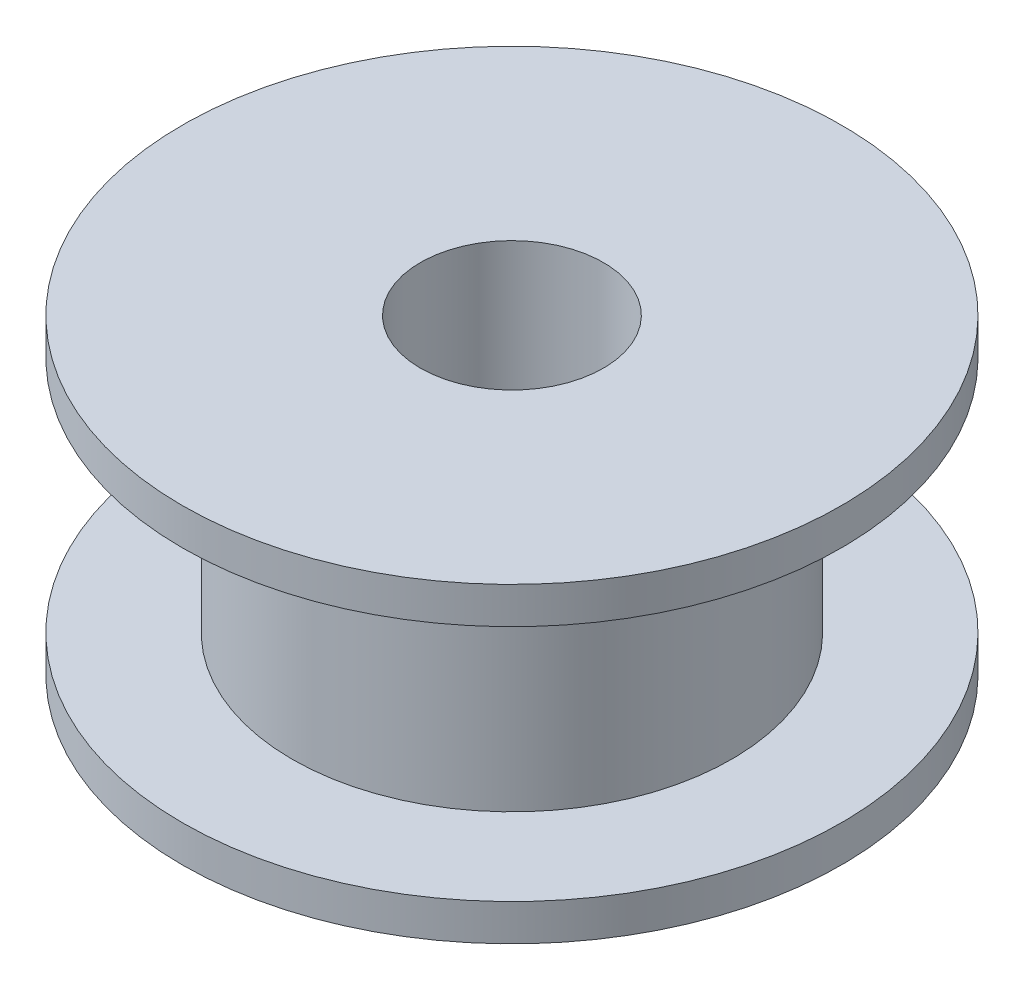
ISO-10303-21;
HEADER;
FILE_DESCRIPTION(('STEP AP214'),'2;1');
FILE_NAME('part.step','',(''),(''),'','','');
FILE_SCHEMA(('AUTOMOTIVE_DESIGN { 1 0 10303 214 1 1 1 1 }'));
ENDSEC;
DATA;
#1=APPLICATION_CONTEXT('core data for automotive mechanical design processes');
#2=APPLICATION_PROTOCOL_DEFINITION('international standard','automotive_design',2000,#1);
#3=PRODUCT_CONTEXT('',#1,'mechanical');
#4=PRODUCT('Part','Part','',(#3));
#5=PRODUCT_RELATED_PRODUCT_CATEGORY('part','',(#4));
#6=PRODUCT_DEFINITION_FORMATION('','',#4);
#7=PRODUCT_DEFINITION_CONTEXT('part definition',#1,'design');
#8=PRODUCT_DEFINITION('design','',#6,#7);
#9=PRODUCT_DEFINITION_SHAPE('','',#8);
#10=(LENGTH_UNIT() NAMED_UNIT(*) SI_UNIT(.MILLI.,.METRE.));
#11=(NAMED_UNIT(*) PLANE_ANGLE_UNIT() SI_UNIT($,.RADIAN.));
#12=(NAMED_UNIT(*) SI_UNIT($,.STERADIAN.) SOLID_ANGLE_UNIT());
#13=UNCERTAINTY_MEASURE_WITH_UNIT(LENGTH_MEASURE(1.E-05),#10,'distance_accuracy_value','');
#14=(GEOMETRIC_REPRESENTATION_CONTEXT(3) GLOBAL_UNCERTAINTY_ASSIGNED_CONTEXT((#13)) GLOBAL_UNIT_ASSIGNED_CONTEXT((#10,
#11,#12)) REPRESENTATION_CONTEXT('',''));
#15=CARTESIAN_POINT('',(0.,0.,0.));
#16=DIRECTION('',(0.,0.,1.));
#17=DIRECTION('',(1.,0.,0.));
#18=AXIS2_PLACEMENT_3D('',#15,#16,#17);
#19=CARTESIAN_POINT('',(9.,4.25,0.));
#20=DIRECTION('',(0.,-1.,0.));
#21=DIRECTION('',(0.,0.,-1.));
#22=AXIS2_PLACEMENT_3D('',#19,#20,#21);
#23=PLANE('',#22);
#24=CARTESIAN_POINT('',(0.,4.25,0.));
#25=DIRECTION('',(0.,1.,0.));
#26=DIRECTION('',(0.,0.,1.));
#27=AXIS2_PLACEMENT_3D('',#24,#25,#26);
#28=CIRCLE('',#27,2.5);
#29=CARTESIAN_POINT('',(0.,4.25,2.5));
#30=VERTEX_POINT('',#29);
#31=EDGE_CURVE('E60',#30,#30,#28,.T.);
#32=ORIENTED_EDGE('',*,*,#31,.F.);
#33=EDGE_LOOP('',(#32));
#34=FACE_BOUND('',#33,.T.);
#35=CARTESIAN_POINT('',(0.,4.25,0.));
#36=DIRECTION('',(0.,1.,0.));
#37=DIRECTION('',(0.,0.,1.));
#38=AXIS2_PLACEMENT_3D('',#35,#36,#37);
#39=CIRCLE('',#38,9.);
#40=CARTESIAN_POINT('',(0.,4.25,9.));
#41=VERTEX_POINT('',#40);
#42=EDGE_CURVE('E54',#41,#41,#39,.T.);
#43=ORIENTED_EDGE('',*,*,#42,.T.);
#44=EDGE_LOOP('',(#43));
#45=FACE_BOUND('',#44,.T.);
#46=ADVANCED_FACE('F32',(#34,#45),#23,.F.);
#47=CARTESIAN_POINT('',(0.,-4.25,0.));
#48=DIRECTION('',(0.,1.,0.));
#49=DIRECTION('',(0.,0.,1.));
#50=AXIS2_PLACEMENT_3D('',#47,#48,#49);
#51=PLANE('',#50);
#52=CARTESIAN_POINT('',(0.,-4.25,0.));
#53=DIRECTION('',(0.,1.,0.));
#54=DIRECTION('',(0.,0.,1.));
#55=AXIS2_PLACEMENT_3D('',#52,#53,#54);
#56=CIRCLE('',#55,2.5);
#57=CARTESIAN_POINT('',(0.,-4.25,2.5));
#58=VERTEX_POINT('',#57);
#59=EDGE_CURVE('E57',#58,#58,#56,.F.);
#60=ORIENTED_EDGE('',*,*,#59,.F.);
#61=EDGE_LOOP('',(#60));
#62=FACE_BOUND('',#61,.T.);
#63=CARTESIAN_POINT('',(0.,-4.25,0.));
#64=DIRECTION('',(0.,1.,0.));
#65=DIRECTION('',(0.,0.,1.));
#66=AXIS2_PLACEMENT_3D('',#63,#64,#65);
#67=CIRCLE('',#66,9.);
#68=CARTESIAN_POINT('',(0.,-4.25,9.));
#69=VERTEX_POINT('',#68);
#70=EDGE_CURVE('E10',#69,#69,#67,.T.);
#71=ORIENTED_EDGE('',*,*,#70,.F.);
#72=EDGE_LOOP('',(#71));
#73=FACE_BOUND('',#72,.T.);
#74=ADVANCED_FACE('F69',(#62,#73),#51,.F.);
#75=CARTESIAN_POINT('',(0.,4.25,0.));
#76=DIRECTION('',(0.,1.,0.));
#77=DIRECTION('',(0.,0.,1.));
#78=AXIS2_PLACEMENT_3D('',#75,#76,#77);
#79=CYLINDRICAL_SURFACE('',#78,9.);
#80=CARTESIAN_POINT('',(0.,-3.25,0.));
#81=DIRECTION('',(0.,1.,0.));
#82=DIRECTION('',(0.,0.,1.));
#83=AXIS2_PLACEMENT_3D('',#80,#81,#82);
#84=CIRCLE('',#83,9.);
#85=CARTESIAN_POINT('',(0.,-3.25,9.));
#86=VERTEX_POINT('',#85);
#87=EDGE_CURVE('E38',#86,#86,#84,.T.);
#88=ORIENTED_EDGE('',*,*,#87,.F.);
#89=EDGE_LOOP('',(#88));
#90=FACE_BOUND('',#89,.T.);
#91=ORIENTED_EDGE('',*,*,#70,.T.);
#92=EDGE_LOOP('',(#91));
#93=FACE_BOUND('',#92,.T.);
#94=ADVANCED_FACE('F92',(#90,#93),#79,.T.);
#95=CARTESIAN_POINT('',(9.,-3.25,0.));
#96=DIRECTION('',(0.,-1.,0.));
#97=DIRECTION('',(0.,0.,-1.));
#98=AXIS2_PLACEMENT_3D('',#95,#96,#97);
#99=PLANE('',#98);
#100=CARTESIAN_POINT('',(0.,-3.25,0.));
#101=DIRECTION('',(0.,1.,0.));
#102=DIRECTION('',(0.,0.,1.));
#103=AXIS2_PLACEMENT_3D('',#100,#101,#102);
#104=CIRCLE('',#103,6.00000000000001);
#105=CARTESIAN_POINT('',(0.,-3.25,6.00000000000001));
#106=VERTEX_POINT('',#105);
#107=EDGE_CURVE('E42',#106,#106,#104,.T.);
#108=ORIENTED_EDGE('',*,*,#107,.F.);
#109=EDGE_LOOP('',(#108));
#110=FACE_BOUND('',#109,.T.);
#111=ORIENTED_EDGE('',*,*,#87,.T.);
#112=EDGE_LOOP('',(#111));
#113=FACE_BOUND('',#112,.T.);
#114=ADVANCED_FACE('F87',(#110,#113),#99,.F.);
#115=CARTESIAN_POINT('',(0.,4.25,0.));
#116=DIRECTION('',(0.,1.,0.));
#117=DIRECTION('',(0.,0.,1.));
#118=AXIS2_PLACEMENT_3D('',#115,#116,#117);
#119=CYLINDRICAL_SURFACE('',#118,6.00000000000001);
#120=CARTESIAN_POINT('',(0.,3.25,0.));
#121=DIRECTION('',(0.,1.,0.));
#122=DIRECTION('',(0.,0.,1.));
#123=AXIS2_PLACEMENT_3D('',#120,#121,#122);
#124=CIRCLE('',#123,6.00000000000001);
#125=CARTESIAN_POINT('',(0.,3.25,6.00000000000001));
#126=VERTEX_POINT('',#125);
#127=EDGE_CURVE('E46',#126,#126,#124,.T.);
#128=ORIENTED_EDGE('',*,*,#127,.F.);
#129=EDGE_LOOP('',(#128));
#130=FACE_BOUND('',#129,.T.);
#131=ORIENTED_EDGE('',*,*,#107,.T.);
#132=EDGE_LOOP('',(#131));
#133=FACE_BOUND('',#132,.T.);
#134=ADVANCED_FACE('F81',(#130,#133),#119,.T.);
#135=CARTESIAN_POINT('',(6.00000000000001,3.25,0.));
#136=DIRECTION('',(0.,1.,0.));
#137=DIRECTION('',(0.,0.,1.));
#138=AXIS2_PLACEMENT_3D('',#135,#136,#137);
#139=PLANE('',#138);
#140=CARTESIAN_POINT('',(0.,3.25,0.));
#141=DIRECTION('',(0.,1.,0.));
#142=DIRECTION('',(0.,0.,1.));
#143=AXIS2_PLACEMENT_3D('',#140,#141,#142);
#144=CIRCLE('',#143,9.);
#145=CARTESIAN_POINT('',(0.,3.25,9.));
#146=VERTEX_POINT('',#145);
#147=EDGE_CURVE('E51',#146,#146,#144,.T.);
#148=ORIENTED_EDGE('',*,*,#147,.F.);
#149=EDGE_LOOP('',(#148));
#150=FACE_BOUND('',#149,.T.);
#151=ORIENTED_EDGE('',*,*,#127,.T.);
#152=EDGE_LOOP('',(#151));
#153=FACE_BOUND('',#152,.T.);
#154=ADVANCED_FACE('F75',(#150,#153),#139,.F.);
#155=CARTESIAN_POINT('',(0.,4.25,0.));
#156=DIRECTION('',(0.,1.,0.));
#157=DIRECTION('',(0.,0.,1.));
#158=AXIS2_PLACEMENT_3D('',#155,#156,#157);
#159=CYLINDRICAL_SURFACE('',#158,9.);
#160=ORIENTED_EDGE('',*,*,#42,.F.);
#161=EDGE_LOOP('',(#160));
#162=FACE_BOUND('',#161,.T.);
#163=ORIENTED_EDGE('',*,*,#147,.T.);
#164=EDGE_LOOP('',(#163));
#165=FACE_BOUND('',#164,.T.);
#166=ADVANCED_FACE('F72',(#162,#165),#159,.T.);
#167=CARTESIAN_POINT('',(0.,-4.251,0.));
#168=DIRECTION('',(0.,1.,0.));
#169=DIRECTION('',(0.,0.,1.));
#170=AXIS2_PLACEMENT_3D('',#167,#168,#169);
#171=CYLINDRICAL_SURFACE('',#170,2.5);
#172=ORIENTED_EDGE('',*,*,#31,.T.);
#173=EDGE_LOOP('',(#172));
#174=FACE_BOUND('',#173,.T.);
#175=ORIENTED_EDGE('',*,*,#59,.T.);
#176=EDGE_LOOP('',(#175));
#177=FACE_BOUND('',#176,.T.);
#178=ADVANCED_FACE('F64',(#174,#177),#171,.F.);
#179=CLOSED_SHELL('',(#46,#74,#94,#114,#134,#154,#166,#178));
#180=MANIFOLD_SOLID_BREP('B2',#179);
#181=ADVANCED_BREP_SHAPE_REPRESENTATION('',(#18,#180),#14);
#182=SHAPE_DEFINITION_REPRESENTATION(#9,#181);
ENDSEC;
END-ISO-10303-21;
